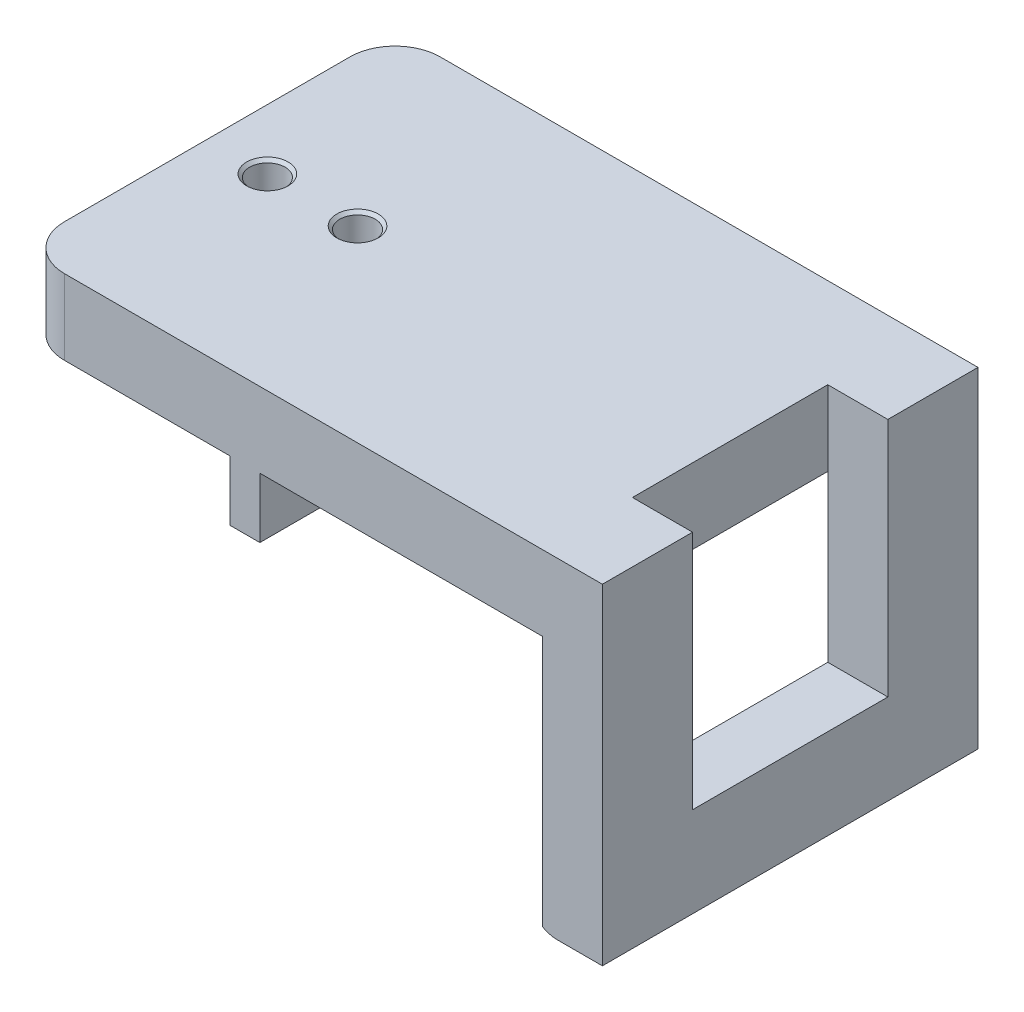
ISO-10303-21;
HEADER;
FILE_DESCRIPTION(('STEP AP214'),'2;1');
FILE_NAME('part.step','',(''),(''),'','','');
FILE_SCHEMA(('AUTOMOTIVE_DESIGN { 1 0 10303 214 1 1 1 1 }'));
ENDSEC;
DATA;
#1=APPLICATION_CONTEXT('core data for automotive mechanical design processes');
#2=APPLICATION_PROTOCOL_DEFINITION('international standard','automotive_design',2000,#1);
#3=PRODUCT_CONTEXT('',#1,'mechanical');
#4=PRODUCT('Part','Part','',(#3));
#5=PRODUCT_RELATED_PRODUCT_CATEGORY('part','',(#4));
#6=PRODUCT_DEFINITION_FORMATION('','',#4);
#7=PRODUCT_DEFINITION_CONTEXT('part definition',#1,'design');
#8=PRODUCT_DEFINITION('design','',#6,#7);
#9=PRODUCT_DEFINITION_SHAPE('','',#8);
#10=(LENGTH_UNIT() NAMED_UNIT(*) SI_UNIT(.MILLI.,.METRE.));
#11=(NAMED_UNIT(*) PLANE_ANGLE_UNIT() SI_UNIT($,.RADIAN.));
#12=(NAMED_UNIT(*) SI_UNIT($,.STERADIAN.) SOLID_ANGLE_UNIT());
#13=UNCERTAINTY_MEASURE_WITH_UNIT(LENGTH_MEASURE(1.E-05),#10,'distance_accuracy_value','');
#14=(GEOMETRIC_REPRESENTATION_CONTEXT(3) GLOBAL_UNCERTAINTY_ASSIGNED_CONTEXT((#13)) GLOBAL_UNIT_ASSIGNED_CONTEXT((#10,
#11,#12)) REPRESENTATION_CONTEXT('',''));
#15=CARTESIAN_POINT('',(0.,0.,0.));
#16=DIRECTION('',(0.,0.,1.));
#17=DIRECTION('',(1.,0.,0.));
#18=AXIS2_PLACEMENT_3D('',#15,#16,#17);
#19=CARTESIAN_POINT('',(44.196,0.,0.));
#20=DIRECTION('',(-1.,0.,0.));
#21=DIRECTION('',(0.,0.,1.));
#22=AXIS2_PLACEMENT_3D('',#19,#20,#21);
#23=PLANE('',#22);
#24=DIRECTION('',(0.,1.,0.));
#25=VECTOR('',#24,1.);
#26=CARTESIAN_POINT('',(44.196,-21.59,-7.62));
#27=LINE('',#26,#25);
#28=CARTESIAN_POINT('',(44.196,-21.2497045256125,-7.62));
#29=VERTEX_POINT('',#28);
#30=CARTESIAN_POINT('',(44.196,-19.05,-7.62));
#31=VERTEX_POINT('',#30);
#32=EDGE_CURVE('E193',#29,#31,#27,.T.);
#33=ORIENTED_EDGE('',*,*,#32,.F.);
#34=DIRECTION('',(0.,0.,1.));
#35=VECTOR('',#34,1.);
#36=CARTESIAN_POINT('',(44.196,-21.2497045256125,-7.62));
#37=LINE('',#36,#35);
#38=CARTESIAN_POINT('',(44.196,-21.2497045256125,0.));
#39=VERTEX_POINT('',#38);
#40=EDGE_CURVE('E184',#29,#39,#37,.T.);
#41=ORIENTED_EDGE('',*,*,#40,.T.);
#42=DIRECTION('',(0.,-1.,0.));
#43=VECTOR('',#42,1.);
#44=CARTESIAN_POINT('',(44.196,6.35,0.));
#45=LINE('',#44,#43);
#46=CARTESIAN_POINT('',(44.196,0.,0.));
#47=VERTEX_POINT('',#46);
#48=EDGE_CURVE('E196',#47,#39,#45,.T.);
#49=ORIENTED_EDGE('',*,*,#48,.F.);
#50=DIRECTION('',(0.,0.,-1.));
#51=VECTOR('',#50,1.);
#52=CARTESIAN_POINT('',(44.196,0.,0.));
#53=LINE('',#52,#51);
#54=CARTESIAN_POINT('',(44.196,0.,-7.62));
#55=VERTEX_POINT('',#54);
#56=EDGE_CURVE('E406',#47,#55,#53,.T.);
#57=ORIENTED_EDGE('',*,*,#56,.T.);
#58=DIRECTION('',(0.,1.,0.));
#59=VECTOR('',#58,1.);
#60=CARTESIAN_POINT('',(44.196,6.35,-7.62));
#61=LINE('',#60,#59);
#62=CARTESIAN_POINT('',(44.196,-13.97,-7.62));
#63=VERTEX_POINT('',#62);
#64=EDGE_CURVE('E215',#63,#55,#61,.T.);
#65=ORIENTED_EDGE('',*,*,#64,.F.);
#66=DIRECTION('',(0.,0.,1.));
#67=VECTOR('',#66,1.);
#68=CARTESIAN_POINT('',(44.196,-13.97,-7.62));
#69=LINE('',#68,#67);
#70=CARTESIAN_POINT('',(44.196,-13.97,-24.13));
#71=VERTEX_POINT('',#70);
#72=EDGE_CURVE('E452',#71,#63,#69,.T.);
#73=ORIENTED_EDGE('',*,*,#72,.F.);
#74=DIRECTION('',(0.,-1.,0.));
#75=VECTOR('',#74,1.);
#76=CARTESIAN_POINT('',(44.196,-13.97,-24.13));
#77=LINE('',#76,#75);
#78=CARTESIAN_POINT('',(44.196,0.,-24.13));
#79=VERTEX_POINT('',#78);
#80=EDGE_CURVE('E420',#79,#71,#77,.T.);
#81=ORIENTED_EDGE('',*,*,#80,.F.);
#82=CARTESIAN_POINT('',(44.196,0.,-31.75));
#83=VERTEX_POINT('',#82);
#84=EDGE_CURVE('E297',#79,#83,#53,.T.);
#85=ORIENTED_EDGE('',*,*,#84,.T.);
#86=DIRECTION('',(0.,1.,0.));
#87=VECTOR('',#86,1.);
#88=CARTESIAN_POINT('',(44.196,6.35,-31.75));
#89=LINE('',#88,#87);
#90=CARTESIAN_POINT('',(44.196,-21.2497045256125,-31.75));
#91=VERTEX_POINT('',#90);
#92=EDGE_CURVE('E238',#91,#83,#89,.T.);
#93=ORIENTED_EDGE('',*,*,#92,.F.);
#94=DIRECTION('',(0.,0.,1.));
#95=VECTOR('',#94,1.);
#96=CARTESIAN_POINT('',(44.196,-21.2497045256125,-31.75));
#97=LINE('',#96,#95);
#98=CARTESIAN_POINT('',(44.196,-21.2497045256125,-24.13));
#99=VERTEX_POINT('',#98);
#100=EDGE_CURVE('E187',#91,#99,#97,.T.);
#101=ORIENTED_EDGE('',*,*,#100,.T.);
#102=DIRECTION('',(0.,-1.,0.));
#103=VECTOR('',#102,1.);
#104=CARTESIAN_POINT('',(44.196,-21.59,-24.13));
#105=LINE('',#104,#103);
#106=CARTESIAN_POINT('',(44.196,-19.05,-24.13));
#107=VERTEX_POINT('',#106);
#108=EDGE_CURVE('E207',#107,#99,#105,.T.);
#109=ORIENTED_EDGE('',*,*,#108,.F.);
#110=DIRECTION('',(0.,0.,-1.));
#111=VECTOR('',#110,1.);
#112=CARTESIAN_POINT('',(44.196,-19.05,-24.13));
#113=LINE('',#112,#111);
#114=EDGE_CURVE('E202',#31,#107,#113,.T.);
#115=ORIENTED_EDGE('',*,*,#114,.F.);
#116=EDGE_LOOP('',(#33,#41,#49,#57,#65,#73,#81,#85,#93,#101,#109,#115));
#117=FACE_BOUND('',#116,.T.);
#118=ADVANCED_FACE('F33',(#117),#23,.T.);
#119=CARTESIAN_POINT('',(44.196,6.35,0.));
#120=DIRECTION('',(-1.,0.,0.));
#121=DIRECTION('',(0.,0.,1.));
#122=AXIS2_PLACEMENT_3D('',#119,#120,#121);
#123=PLANE('',#122);
#124=CARTESIAN_POINT('',(44.196,6.35,-7.62));
#125=VERTEX_POINT('',#124);
#126=EDGE_CURVE('E188',#55,#125,#61,.T.);
#127=ORIENTED_EDGE('',*,*,#126,.F.);
#128=EDGE_CURVE('E305',#55,#79,#53,.T.);
#129=ORIENTED_EDGE('',*,*,#128,.T.);
#130=CARTESIAN_POINT('',(44.196,6.35,-24.13));
#131=VERTEX_POINT('',#130);
#132=EDGE_CURVE('E434',#131,#79,#77,.T.);
#133=ORIENTED_EDGE('',*,*,#132,.F.);
#134=DIRECTION('',(0.,0.,-1.));
#135=VECTOR('',#134,1.);
#136=CARTESIAN_POINT('',(44.196,6.35,0.));
#137=LINE('',#136,#135);
#138=EDGE_CURVE('E355',#125,#131,#137,.T.);
#139=ORIENTED_EDGE('',*,*,#138,.F.);
#140=EDGE_LOOP('',(#127,#129,#133,#139));
#141=FACE_BOUND('',#140,.T.);
#142=ADVANCED_FACE('F432',(#141),#123,.F.);
#143=CARTESIAN_POINT('',(0.,0.,0.));
#144=DIRECTION('',(0.,-1.,0.));
#145=DIRECTION('',(0.,0.,-1.));
#146=AXIS2_PLACEMENT_3D('',#143,#144,#145);
#147=PLANE('',#146);
#148=DIRECTION('',(0.,0.,1.));
#149=VECTOR('',#148,1.);
#150=CARTESIAN_POINT('',(20.32,0.,0.));
#151=LINE('',#150,#149);
#152=CARTESIAN_POINT('',(20.32,0.,-31.75));
#153=VERTEX_POINT('',#152);
#154=CARTESIAN_POINT('',(20.32,0.,0.));
#155=VERTEX_POINT('',#154);
#156=EDGE_CURVE('E257',#153,#155,#151,.T.);
#157=ORIENTED_EDGE('',*,*,#156,.F.);
#158=DIRECTION('',(-1.,0.,0.));
#159=VECTOR('',#158,1.);
#160=CARTESIAN_POINT('',(0.,0.,-31.75));
#161=LINE('',#160,#159);
#162=EDGE_CURVE('E400',#83,#153,#161,.T.);
#163=ORIENTED_EDGE('',*,*,#162,.F.);
#164=ORIENTED_EDGE('',*,*,#84,.F.);
#165=ORIENTED_EDGE('',*,*,#128,.F.);
#166=ORIENTED_EDGE('',*,*,#56,.F.);
#167=DIRECTION('',(1.,0.,0.));
#168=VECTOR('',#167,1.);
#169=CARTESIAN_POINT('',(0.,0.,0.));
#170=LINE('',#169,#168);
#171=EDGE_CURVE('E298',#155,#47,#170,.T.);
#172=ORIENTED_EDGE('',*,*,#171,.F.);
#173=EDGE_LOOP('',(#157,#163,#164,#165,#166,#172));
#174=FACE_BOUND('',#173,.T.);
#175=ADVANCED_FACE('F398',(#174),#147,.T.);
#176=CARTESIAN_POINT('',(0.,6.35,0.));
#177=DIRECTION('',(1.,0.,0.));
#178=DIRECTION('',(0.,0.,-1.));
#179=AXIS2_PLACEMENT_3D('',#176,#177,#178);
#180=PLANE('',#179);
#181=DIRECTION('',(0.,0.,1.));
#182=VECTOR('',#181,1.);
#183=CARTESIAN_POINT('',(0.,0.,0.));
#184=LINE('',#183,#182);
#185=CARTESIAN_POINT('',(0.,0.,-27.94));
#186=VERTEX_POINT('',#185);
#187=CARTESIAN_POINT('',(0.,0.,-3.81));
#188=VERTEX_POINT('',#187);
#189=EDGE_CURVE('E303',#186,#188,#184,.T.);
#190=ORIENTED_EDGE('',*,*,#189,.T.);
#191=DIRECTION('',(0.,-1.,0.));
#192=VECTOR('',#191,1.);
#193=CARTESIAN_POINT('',(0.,6.35,-3.81));
#194=LINE('',#193,#192);
#195=CARTESIAN_POINT('',(0.,6.35,-3.81));
#196=VERTEX_POINT('',#195);
#197=EDGE_CURVE('E334',#188,#196,#194,.F.);
#198=ORIENTED_EDGE('',*,*,#197,.T.);
#199=DIRECTION('',(0.,0.,1.));
#200=VECTOR('',#199,1.);
#201=CARTESIAN_POINT('',(0.,6.35,0.));
#202=LINE('',#201,#200);
#203=CARTESIAN_POINT('',(0.,6.35,-27.94));
#204=VERTEX_POINT('',#203);
#205=EDGE_CURVE('E405',#204,#196,#202,.T.);
#206=ORIENTED_EDGE('',*,*,#205,.F.);
#207=DIRECTION('',(0.,-1.,0.));
#208=VECTOR('',#207,1.);
#209=CARTESIAN_POINT('',(0.,6.35,-27.94));
#210=LINE('',#209,#208);
#211=EDGE_CURVE('E337',#204,#186,#210,.T.);
#212=ORIENTED_EDGE('',*,*,#211,.T.);
#213=EDGE_LOOP('',(#190,#198,#206,#212));
#214=FACE_BOUND('',#213,.T.);
#215=ADVANCED_FACE('F332',(#214),#180,.F.);
#216=CARTESIAN_POINT('',(0.,6.35,0.));
#217=DIRECTION('',(0.,0.,-1.));
#218=DIRECTION('',(-1.,0.,0.));
#219=AXIS2_PLACEMENT_3D('',#216,#217,#218);
#220=PLANE('',#219);
#221=ORIENTED_EDGE('',*,*,#48,.T.);
#222=CARTESIAN_POINT('',(45.466,-19.05,0.));
#223=DIRECTION('',(0.,0.,-1.));
#224=DIRECTION('',(-1.,0.,0.));
#225=AXIS2_PLACEMENT_3D('',#222,#223,#224);
#226=CIRCLE('',#225,2.54);
#227=CARTESIAN_POINT('',(45.466,-21.59,0.));
#228=VERTEX_POINT('',#227);
#229=EDGE_CURVE('E56',#39,#228,#226,.F.);
#230=ORIENTED_EDGE('',*,*,#229,.T.);
#231=DIRECTION('',(-1.,0.,0.));
#232=VECTOR('',#231,1.);
#233=CARTESIAN_POINT('',(49.276,-21.59,0.));
#234=LINE('',#233,#232);
#235=CARTESIAN_POINT('',(49.276,-21.59,0.));
#236=VERTEX_POINT('',#235);
#237=EDGE_CURVE('E239',#236,#228,#234,.T.);
#238=ORIENTED_EDGE('',*,*,#237,.F.);
#239=DIRECTION('',(0.,-1.,0.));
#240=VECTOR('',#239,1.);
#241=CARTESIAN_POINT('',(49.276,6.35,0.));
#242=LINE('',#241,#240);
#243=CARTESIAN_POINT('',(49.276,6.35,0.));
#244=VERTEX_POINT('',#243);
#245=EDGE_CURVE('E214',#244,#236,#242,.T.);
#246=ORIENTED_EDGE('',*,*,#245,.F.);
#247=DIRECTION('',(1.,0.,0.));
#248=VECTOR('',#247,1.);
#249=CARTESIAN_POINT('',(0.,6.35,0.));
#250=LINE('',#249,#248);
#251=CARTESIAN_POINT('',(3.81,6.35,0.));
#252=VERTEX_POINT('',#251);
#253=EDGE_CURVE('E359',#252,#244,#250,.T.);
#254=ORIENTED_EDGE('',*,*,#253,.F.);
#255=DIRECTION('',(0.,-1.,0.));
#256=VECTOR('',#255,1.);
#257=CARTESIAN_POINT('',(3.81,6.35,0.));
#258=LINE('',#257,#256);
#259=CARTESIAN_POINT('',(3.81,0.,0.));
#260=VERTEX_POINT('',#259);
#261=EDGE_CURVE('E293',#252,#260,#258,.T.);
#262=ORIENTED_EDGE('',*,*,#261,.T.);
#263=CARTESIAN_POINT('',(17.78,0.,0.));
#264=VERTEX_POINT('',#263);
#265=EDGE_CURVE('E294',#260,#264,#170,.T.);
#266=ORIENTED_EDGE('',*,*,#265,.T.);
#267=DIRECTION('',(0.,1.,0.));
#268=VECTOR('',#267,1.);
#269=CARTESIAN_POINT('',(17.78,-5.08,0.));
#270=LINE('',#269,#268);
#271=CARTESIAN_POINT('',(17.78,-5.08,0.));
#272=VERTEX_POINT('',#271);
#273=EDGE_CURVE('E318',#272,#264,#270,.T.);
#274=ORIENTED_EDGE('',*,*,#273,.F.);
#275=DIRECTION('',(-1.,0.,0.));
#276=VECTOR('',#275,1.);
#277=CARTESIAN_POINT('',(20.32,-5.08,0.));
#278=LINE('',#277,#276);
#279=CARTESIAN_POINT('',(20.32,-5.08,0.));
#280=VERTEX_POINT('',#279);
#281=EDGE_CURVE('E244',#280,#272,#278,.T.);
#282=ORIENTED_EDGE('',*,*,#281,.F.);
#283=DIRECTION('',(0.,1.,0.));
#284=VECTOR('',#283,1.);
#285=CARTESIAN_POINT('',(20.32,-5.08,0.));
#286=LINE('',#285,#284);
#287=EDGE_CURVE('E323',#280,#155,#286,.T.);
#288=ORIENTED_EDGE('',*,*,#287,.T.);
#289=ORIENTED_EDGE('',*,*,#171,.T.);
#290=EDGE_LOOP('',(#221,#230,#238,#246,#254,#262,#266,#274,#282,#288,#289));
#291=FACE_BOUND('',#290,.T.);
#292=ADVANCED_FACE('F379',(#291),#220,.F.);
#293=CARTESIAN_POINT('',(0.,6.35,-31.75));
#294=DIRECTION('',(0.,0.,1.));
#295=DIRECTION('',(1.,0.,0.));
#296=AXIS2_PLACEMENT_3D('',#293,#294,#295);
#297=PLANE('',#296);
#298=DIRECTION('',(-1.,0.,0.));
#299=VECTOR('',#298,1.);
#300=CARTESIAN_POINT('',(49.276,-21.59,-31.75));
#301=LINE('',#300,#299);
#302=CARTESIAN_POINT('',(49.276,-21.59,-31.75));
#303=VERTEX_POINT('',#302);
#304=CARTESIAN_POINT('',(45.466,-21.59,-31.75));
#305=VERTEX_POINT('',#304);
#306=EDGE_CURVE('E424',#303,#305,#301,.T.);
#307=ORIENTED_EDGE('',*,*,#306,.T.);
#308=CARTESIAN_POINT('',(45.466,-19.05,-31.75));
#309=DIRECTION('',(0.,0.,1.));
#310=DIRECTION('',(1.,0.,0.));
#311=AXIS2_PLACEMENT_3D('',#308,#309,#310);
#312=CIRCLE('',#311,2.54);
#313=EDGE_CURVE('E41',#305,#91,#312,.F.);
#314=ORIENTED_EDGE('',*,*,#313,.T.);
#315=ORIENTED_EDGE('',*,*,#92,.T.);
#316=ORIENTED_EDGE('',*,*,#162,.T.);
#317=DIRECTION('',(0.,1.,0.));
#318=VECTOR('',#317,1.);
#319=CARTESIAN_POINT('',(20.32,-5.08,-31.75));
#320=LINE('',#319,#318);
#321=CARTESIAN_POINT('',(20.32,-5.08,-31.75));
#322=VERTEX_POINT('',#321);
#323=EDGE_CURVE('E251',#322,#153,#320,.T.);
#324=ORIENTED_EDGE('',*,*,#323,.F.);
#325=DIRECTION('',(1.,0.,0.));
#326=VECTOR('',#325,1.);
#327=CARTESIAN_POINT('',(20.32,-5.08,-31.75));
#328=LINE('',#327,#326);
#329=CARTESIAN_POINT('',(17.78,-5.08,-31.75));
#330=VERTEX_POINT('',#329);
#331=EDGE_CURVE('E249',#330,#322,#328,.T.);
#332=ORIENTED_EDGE('',*,*,#331,.F.);
#333=DIRECTION('',(0.,1.,0.));
#334=VECTOR('',#333,1.);
#335=CARTESIAN_POINT('',(17.78,-5.08,-31.75));
#336=LINE('',#335,#334);
#337=CARTESIAN_POINT('',(17.78,0.,-31.75));
#338=VERTEX_POINT('',#337);
#339=EDGE_CURVE('E265',#330,#338,#336,.T.);
#340=ORIENTED_EDGE('',*,*,#339,.T.);
#341=CARTESIAN_POINT('',(3.81,0.,-31.75));
#342=VERTEX_POINT('',#341);
#343=EDGE_CURVE('E312',#338,#342,#161,.T.);
#344=ORIENTED_EDGE('',*,*,#343,.T.);
#345=DIRECTION('',(0.,-1.,0.));
#346=VECTOR('',#345,1.);
#347=CARTESIAN_POINT('',(3.81,6.35,-31.75));
#348=LINE('',#347,#346);
#349=CARTESIAN_POINT('',(3.81,6.35,-31.75));
#350=VERTEX_POINT('',#349);
#351=EDGE_CURVE('E353',#342,#350,#348,.F.);
#352=ORIENTED_EDGE('',*,*,#351,.T.);
#353=DIRECTION('',(-1.,0.,0.));
#354=VECTOR('',#353,1.);
#355=CARTESIAN_POINT('',(0.,6.35,-31.75));
#356=LINE('',#355,#354);
#357=CARTESIAN_POINT('',(49.276,6.35,-31.75));
#358=VERTEX_POINT('',#357);
#359=EDGE_CURVE('E272',#358,#350,#356,.T.);
#360=ORIENTED_EDGE('',*,*,#359,.F.);
#361=DIRECTION('',(0.,1.,0.));
#362=VECTOR('',#361,1.);
#363=CARTESIAN_POINT('',(49.276,6.35,-31.75));
#364=LINE('',#363,#362);
#365=EDGE_CURVE('E219',#303,#358,#364,.T.);
#366=ORIENTED_EDGE('',*,*,#365,.F.);
#367=EDGE_LOOP('',(#307,#314,#315,#316,#324,#332,#340,#344,#352,#360,#366));
#368=FACE_BOUND('',#367,.T.);
#369=ADVANCED_FACE('F403',(#368),#297,.F.);
#370=CARTESIAN_POINT('',(0.,6.35,0.));
#371=DIRECTION('',(0.,-1.,0.));
#372=DIRECTION('',(0.,0.,-1.));
#373=AXIS2_PLACEMENT_3D('',#370,#371,#372);
#374=PLANE('',#373);
#375=CARTESIAN_POINT('',(12.7,6.35,-15.875));
#376=DIRECTION('',(0.,-1.,0.));
#377=DIRECTION('',(0.,0.,-1.));
#378=AXIS2_PLACEMENT_3D('',#375,#376,#377);
#379=CIRCLE('',#378,1.75399999999999);
#380=CARTESIAN_POINT('',(12.7,6.35,-17.629));
#381=VERTEX_POINT('',#380);
#382=EDGE_CURVE('E290',#381,#381,#379,.T.);
#383=ORIENTED_EDGE('',*,*,#382,.T.);
#384=EDGE_LOOP('',(#383));
#385=FACE_BOUND('',#384,.T.);
#386=CARTESIAN_POINT('',(5.08,6.35,-15.875));
#387=DIRECTION('',(0.,-1.,0.));
#388=DIRECTION('',(0.,0.,-1.));
#389=AXIS2_PLACEMENT_3D('',#386,#387,#388);
#390=CIRCLE('',#389,1.75399999999999);
#391=CARTESIAN_POINT('',(5.08,6.35,-17.629));
#392=VERTEX_POINT('',#391);
#393=EDGE_CURVE('E287',#392,#392,#390,.T.);
#394=ORIENTED_EDGE('',*,*,#393,.T.);
#395=EDGE_LOOP('',(#394));
#396=FACE_BOUND('',#395,.T.);
#397=ORIENTED_EDGE('',*,*,#205,.T.);
#398=CARTESIAN_POINT('',(3.81,6.35,-3.81));
#399=DIRECTION('',(0.,-1.,0.));
#400=DIRECTION('',(0.,0.,-1.));
#401=AXIS2_PLACEMENT_3D('',#398,#399,#400);
#402=CIRCLE('',#401,3.81);
#403=EDGE_CURVE('E345',#196,#252,#402,.F.);
#404=ORIENTED_EDGE('',*,*,#403,.T.);
#405=ORIENTED_EDGE('',*,*,#253,.T.);
#406=DIRECTION('',(0.,0.,1.));
#407=VECTOR('',#406,1.);
#408=CARTESIAN_POINT('',(49.276,6.35,0.));
#409=LINE('',#408,#407);
#410=CARTESIAN_POINT('',(49.276,6.35,-7.62));
#411=VERTEX_POINT('',#410);
#412=EDGE_CURVE('E211',#411,#244,#409,.T.);
#413=ORIENTED_EDGE('',*,*,#412,.F.);
#414=DIRECTION('',(-1.,0.,0.));
#415=VECTOR('',#414,1.);
#416=CARTESIAN_POINT('',(49.276,6.35,-7.62));
#417=LINE('',#416,#415);
#418=EDGE_CURVE('E230',#411,#125,#417,.T.);
#419=ORIENTED_EDGE('',*,*,#418,.T.);
#420=ORIENTED_EDGE('',*,*,#138,.T.);
#421=DIRECTION('',(-1.,0.,0.));
#422=VECTOR('',#421,1.);
#423=CARTESIAN_POINT('',(49.276,6.35,-24.13));
#424=LINE('',#423,#422);
#425=CARTESIAN_POINT('',(49.276,6.35,-24.13));
#426=VERTEX_POINT('',#425);
#427=EDGE_CURVE('E451',#426,#131,#424,.T.);
#428=ORIENTED_EDGE('',*,*,#427,.F.);
#429=DIRECTION('',(0.,0.,1.));
#430=VECTOR('',#429,1.);
#431=CARTESIAN_POINT('',(49.276,6.35,-24.13));
#432=LINE('',#431,#430);
#433=EDGE_CURVE('E222',#358,#426,#432,.T.);
#434=ORIENTED_EDGE('',*,*,#433,.F.);
#435=ORIENTED_EDGE('',*,*,#359,.T.);
#436=CARTESIAN_POINT('',(3.81,6.35,-27.94));
#437=DIRECTION('',(0.,-1.,0.));
#438=DIRECTION('',(0.,0.,-1.));
#439=AXIS2_PLACEMENT_3D('',#436,#437,#438);
#440=CIRCLE('',#439,3.81);
#441=EDGE_CURVE('E346',#350,#204,#440,.F.);
#442=ORIENTED_EDGE('',*,*,#441,.T.);
#443=EDGE_LOOP('',(#397,#404,#405,#413,#419,#420,#428,#434,#435,#442));
#444=FACE_BOUND('',#443,.T.);
#445=ADVANCED_FACE('F368',(#385,#396,#444),#374,.F.);
#446=CARTESIAN_POINT('',(5.08,0.,-15.875));
#447=DIRECTION('',(0.,-1.,0.));
#448=DIRECTION('',(0.,0.,-1.));
#449=AXIS2_PLACEMENT_3D('',#446,#447,#448);
#450=CIRCLE('',#449,1.754);
#451=CARTESIAN_POINT('',(5.08,0.,-17.629));
#452=VERTEX_POINT('',#451);
#453=EDGE_CURVE('E278',#452,#452,#450,.F.);
#454=ORIENTED_EDGE('',*,*,#453,.T.);
#455=EDGE_LOOP('',(#454));
#456=FACE_BOUND('',#455,.T.);
#457=CARTESIAN_POINT('',(12.7,0.,-15.875));
#458=DIRECTION('',(0.,-1.,0.));
#459=DIRECTION('',(0.,0.,-1.));
#460=AXIS2_PLACEMENT_3D('',#457,#458,#459);
#461=CIRCLE('',#460,1.754);
#462=CARTESIAN_POINT('',(12.7,0.,-17.629));
#463=VERTEX_POINT('',#462);
#464=EDGE_CURVE('E275',#463,#463,#461,.F.);
#465=ORIENTED_EDGE('',*,*,#464,.T.);
#466=EDGE_LOOP('',(#465));
#467=FACE_BOUND('',#466,.T.);
#468=ORIENTED_EDGE('',*,*,#265,.F.);
#469=CARTESIAN_POINT('',(3.81,0.,-3.81));
#470=DIRECTION('',(0.,-1.,0.));
#471=DIRECTION('',(0.,0.,-1.));
#472=AXIS2_PLACEMENT_3D('',#469,#470,#471);
#473=CIRCLE('',#472,3.81);
#474=EDGE_CURVE('E343',#260,#188,#473,.T.);
#475=ORIENTED_EDGE('',*,*,#474,.T.);
#476=ORIENTED_EDGE('',*,*,#189,.F.);
#477=CARTESIAN_POINT('',(3.81,0.,-27.94));
#478=DIRECTION('',(0.,-1.,0.));
#479=DIRECTION('',(0.,0.,-1.));
#480=AXIS2_PLACEMENT_3D('',#477,#478,#479);
#481=CIRCLE('',#480,3.81);
#482=EDGE_CURVE('E375',#186,#342,#481,.T.);
#483=ORIENTED_EDGE('',*,*,#482,.T.);
#484=ORIENTED_EDGE('',*,*,#343,.F.);
#485=DIRECTION('',(0.,0.,-1.));
#486=VECTOR('',#485,1.);
#487=CARTESIAN_POINT('',(17.78,0.,0.));
#488=LINE('',#487,#486);
#489=EDGE_CURVE('E245',#264,#338,#488,.T.);
#490=ORIENTED_EDGE('',*,*,#489,.F.);
#491=EDGE_LOOP('',(#468,#475,#476,#483,#484,#490));
#492=FACE_BOUND('',#491,.T.);
#493=ADVANCED_FACE('F383',(#456,#467,#492),#147,.T.);
#494=CARTESIAN_POINT('',(20.32,-5.08,0.));
#495=DIRECTION('',(-1.,0.,0.));
#496=DIRECTION('',(0.,0.,1.));
#497=AXIS2_PLACEMENT_3D('',#494,#495,#496);
#498=PLANE('',#497);
#499=ORIENTED_EDGE('',*,*,#156,.T.);
#500=ORIENTED_EDGE('',*,*,#287,.F.);
#501=DIRECTION('',(0.,0.,1.));
#502=VECTOR('',#501,1.);
#503=CARTESIAN_POINT('',(20.32,-5.08,0.));
#504=LINE('',#503,#502);
#505=EDGE_CURVE('E241',#322,#280,#504,.T.);
#506=ORIENTED_EDGE('',*,*,#505,.F.);
#507=ORIENTED_EDGE('',*,*,#323,.T.);
#508=EDGE_LOOP('',(#499,#500,#506,#507));
#509=FACE_BOUND('',#508,.T.);
#510=ADVANCED_FACE('F394',(#509),#498,.F.);
#511=CARTESIAN_POINT('',(17.78,-5.08,0.));
#512=DIRECTION('',(1.,0.,0.));
#513=DIRECTION('',(0.,0.,-1.));
#514=AXIS2_PLACEMENT_3D('',#511,#512,#513);
#515=PLANE('',#514);
#516=ORIENTED_EDGE('',*,*,#489,.T.);
#517=ORIENTED_EDGE('',*,*,#339,.F.);
#518=DIRECTION('',(0.,0.,-1.));
#519=VECTOR('',#518,1.);
#520=CARTESIAN_POINT('',(17.78,-5.08,0.));
#521=LINE('',#520,#519);
#522=EDGE_CURVE('E247',#272,#330,#521,.T.);
#523=ORIENTED_EDGE('',*,*,#522,.F.);
#524=ORIENTED_EDGE('',*,*,#273,.T.);
#525=EDGE_LOOP('',(#516,#517,#523,#524));
#526=FACE_BOUND('',#525,.T.);
#527=ADVANCED_FACE('F387',(#526),#515,.F.);
#528=CARTESIAN_POINT('',(0.,-5.08,0.));
#529=DIRECTION('',(0.,1.,0.));
#530=DIRECTION('',(0.,0.,1.));
#531=AXIS2_PLACEMENT_3D('',#528,#529,#530);
#532=PLANE('',#531);
#533=ORIENTED_EDGE('',*,*,#505,.T.);
#534=ORIENTED_EDGE('',*,*,#281,.T.);
#535=ORIENTED_EDGE('',*,*,#522,.T.);
#536=ORIENTED_EDGE('',*,*,#331,.T.);
#537=EDGE_LOOP('',(#533,#534,#535,#536));
#538=FACE_BOUND('',#537,.T.);
#539=ADVANCED_FACE('F390',(#538),#532,.F.);
#540=CARTESIAN_POINT('',(12.7,6.35,-15.875));
#541=DIRECTION('',(0.,1.,0.));
#542=DIRECTION('',(0.,0.,1.));
#543=AXIS2_PLACEMENT_3D('',#540,#541,#542);
#544=CYLINDRICAL_SURFACE('',#543,1.49999999999999);
#545=CARTESIAN_POINT('',(12.7,0.254000000000011,-15.875));
#546=DIRECTION('',(0.,-1.,0.));
#547=DIRECTION('',(0.,0.,-1.));
#548=AXIS2_PLACEMENT_3D('',#545,#546,#547);
#549=CIRCLE('',#548,1.49999999999999);
#550=CARTESIAN_POINT('',(12.7,0.254000000000011,-17.375));
#551=VERTEX_POINT('',#550);
#552=EDGE_CURVE('E284',#551,#551,#549,.T.);
#553=ORIENTED_EDGE('',*,*,#552,.T.);
#554=EDGE_LOOP('',(#553));
#555=FACE_BOUND('',#554,.T.);
#556=CARTESIAN_POINT('',(12.7,6.096,-15.875));
#557=DIRECTION('',(0.,-1.,0.));
#558=DIRECTION('',(0.,0.,-1.));
#559=AXIS2_PLACEMENT_3D('',#556,#557,#558);
#560=CIRCLE('',#559,1.49999999999999);
#561=CARTESIAN_POINT('',(12.7,6.096,-17.375));
#562=VERTEX_POINT('',#561);
#563=EDGE_CURVE('E281',#562,#562,#560,.F.);
#564=ORIENTED_EDGE('',*,*,#563,.T.);
#565=EDGE_LOOP('',(#564));
#566=FACE_BOUND('',#565,.T.);
#567=ADVANCED_FACE('F675',(#555,#566),#544,.F.);
#568=CARTESIAN_POINT('',(5.08,6.35,-15.875));
#569=DIRECTION('',(0.,1.,0.));
#570=DIRECTION('',(0.,0.,1.));
#571=AXIS2_PLACEMENT_3D('',#568,#569,#570);
#572=CYLINDRICAL_SURFACE('',#571,1.49999999999999);
#573=CARTESIAN_POINT('',(5.08,0.254000000000011,-15.875));
#574=DIRECTION('',(0.,-1.,0.));
#575=DIRECTION('',(0.,0.,-1.));
#576=AXIS2_PLACEMENT_3D('',#573,#574,#575);
#577=CIRCLE('',#576,1.49999999999999);
#578=CARTESIAN_POINT('',(5.08,0.254000000000011,-17.375));
#579=VERTEX_POINT('',#578);
#580=EDGE_CURVE('E271',#579,#579,#577,.T.);
#581=ORIENTED_EDGE('',*,*,#580,.T.);
#582=EDGE_LOOP('',(#581));
#583=FACE_BOUND('',#582,.T.);
#584=CARTESIAN_POINT('',(5.08,6.096,-15.875));
#585=DIRECTION('',(0.,-1.,0.));
#586=DIRECTION('',(0.,0.,-1.));
#587=AXIS2_PLACEMENT_3D('',#584,#585,#586);
#588=CIRCLE('',#587,1.49999999999999);
#589=CARTESIAN_POINT('',(5.08,6.096,-17.375));
#590=VERTEX_POINT('',#589);
#591=EDGE_CURVE('E268',#590,#590,#588,.F.);
#592=ORIENTED_EDGE('',*,*,#591,.T.);
#593=EDGE_LOOP('',(#592));
#594=FACE_BOUND('',#593,.T.);
#595=ADVANCED_FACE('F665',(#583,#594),#572,.F.);
#596=CARTESIAN_POINT('',(5.08,0.254000000000011,-15.875));
#597=DIRECTION('',(0.,-1.,0.));
#598=DIRECTION('',(0.,0.,-1.));
#599=AXIS2_PLACEMENT_3D('',#596,#597,#598);
#600=CONICAL_SURFACE('',#599,1.49999999999999,0.785398163397438);
#601=ORIENTED_EDGE('',*,*,#453,.F.);
#602=EDGE_LOOP('',(#601));
#603=FACE_BOUND('',#602,.T.);
#604=ORIENTED_EDGE('',*,*,#580,.F.);
#605=EDGE_LOOP('',(#604));
#606=FACE_BOUND('',#605,.T.);
#607=ADVANCED_FACE('F655',(#603,#606),#600,.F.);
#608=CARTESIAN_POINT('',(12.7,0.254000000000011,-15.875));
#609=DIRECTION('',(0.,-1.,0.));
#610=DIRECTION('',(0.,0.,-1.));
#611=AXIS2_PLACEMENT_3D('',#608,#609,#610);
#612=CONICAL_SURFACE('',#611,1.49999999999999,0.785398163397438);
#613=ORIENTED_EDGE('',*,*,#464,.F.);
#614=EDGE_LOOP('',(#613));
#615=FACE_BOUND('',#614,.T.);
#616=ORIENTED_EDGE('',*,*,#552,.F.);
#617=EDGE_LOOP('',(#616));
#618=FACE_BOUND('',#617,.T.);
#619=ADVANCED_FACE('F645',(#615,#618),#612,.F.);
#620=CARTESIAN_POINT('',(12.7,6.096,-15.875));
#621=DIRECTION('',(0.,1.,0.));
#622=DIRECTION('',(0.,0.,1.));
#623=AXIS2_PLACEMENT_3D('',#620,#621,#622);
#624=CONICAL_SURFACE('',#623,1.49999999999999,0.785398163397438);
#625=ORIENTED_EDGE('',*,*,#382,.F.);
#626=EDGE_LOOP('',(#625));
#627=FACE_BOUND('',#626,.T.);
#628=ORIENTED_EDGE('',*,*,#563,.F.);
#629=EDGE_LOOP('',(#628));
#630=FACE_BOUND('',#629,.T.);
#631=ADVANCED_FACE('F635',(#627,#630),#624,.F.);
#632=CARTESIAN_POINT('',(5.08,6.096,-15.875));
#633=DIRECTION('',(0.,1.,0.));
#634=DIRECTION('',(0.,0.,1.));
#635=AXIS2_PLACEMENT_3D('',#632,#633,#634);
#636=CONICAL_SURFACE('',#635,1.49999999999999,0.785398163397438);
#637=ORIENTED_EDGE('',*,*,#393,.F.);
#638=EDGE_LOOP('',(#637));
#639=FACE_BOUND('',#638,.T.);
#640=ORIENTED_EDGE('',*,*,#591,.F.);
#641=EDGE_LOOP('',(#640));
#642=FACE_BOUND('',#641,.T.);
#643=ADVANCED_FACE('F610',(#639,#642),#636,.F.);
#644=CARTESIAN_POINT('',(3.81,6.35,-3.81));
#645=DIRECTION('',(0.,-1.,0.));
#646=DIRECTION('',(0.,0.,-1.));
#647=AXIS2_PLACEMENT_3D('',#644,#645,#646);
#648=CYLINDRICAL_SURFACE('',#647,3.81);
#649=ORIENTED_EDGE('',*,*,#403,.F.);
#650=ORIENTED_EDGE('',*,*,#197,.F.);
#651=ORIENTED_EDGE('',*,*,#474,.F.);
#652=ORIENTED_EDGE('',*,*,#261,.F.);
#653=EDGE_LOOP('',(#649,#650,#651,#652));
#654=FACE_BOUND('',#653,.T.);
#655=ADVANCED_FACE('F341',(#654),#648,.T.);
#656=CARTESIAN_POINT('',(3.81,6.35,-27.94));
#657=DIRECTION('',(0.,-1.,0.));
#658=DIRECTION('',(0.,0.,-1.));
#659=AXIS2_PLACEMENT_3D('',#656,#657,#658);
#660=CYLINDRICAL_SURFACE('',#659,3.81);
#661=ORIENTED_EDGE('',*,*,#441,.F.);
#662=ORIENTED_EDGE('',*,*,#351,.F.);
#663=ORIENTED_EDGE('',*,*,#482,.F.);
#664=ORIENTED_EDGE('',*,*,#211,.F.);
#665=EDGE_LOOP('',(#661,#662,#663,#664));
#666=FACE_BOUND('',#665,.T.);
#667=ADVANCED_FACE('F374',(#666),#660,.T.);
#668=CARTESIAN_POINT('',(49.276,-21.59,-31.75));
#669=DIRECTION('',(0.,1.,0.));
#670=DIRECTION('',(0.,0.,1.));
#671=AXIS2_PLACEMENT_3D('',#668,#669,#670);
#672=PLANE('',#671);
#673=ORIENTED_EDGE('',*,*,#237,.T.);
#674=DIRECTION('',(0.,0.,1.));
#675=VECTOR('',#674,1.);
#676=CARTESIAN_POINT('',(45.466,-21.59,-31.75));
#677=LINE('',#676,#675);
#678=EDGE_CURVE('E48',#228,#305,#677,.F.);
#679=ORIENTED_EDGE('',*,*,#678,.T.);
#680=ORIENTED_EDGE('',*,*,#306,.F.);
#681=DIRECTION('',(0.,0.,-1.));
#682=VECTOR('',#681,1.);
#683=CARTESIAN_POINT('',(49.276,-21.59,-31.75));
#684=LINE('',#683,#682);
#685=EDGE_CURVE('E217',#236,#303,#684,.T.);
#686=ORIENTED_EDGE('',*,*,#685,.F.);
#687=EDGE_LOOP('',(#673,#679,#680,#686));
#688=FACE_BOUND('',#687,.T.);
#689=ADVANCED_FACE('F459',(#688),#672,.F.);
#690=CARTESIAN_POINT('',(49.276,-13.97,-24.13));
#691=DIRECTION('',(0.,0.,-1.));
#692=DIRECTION('',(-1.,0.,0.));
#693=AXIS2_PLACEMENT_3D('',#690,#691,#692);
#694=PLANE('',#693);
#695=ORIENTED_EDGE('',*,*,#132,.T.);
#696=ORIENTED_EDGE('',*,*,#80,.T.);
#697=DIRECTION('',(-1.,0.,0.));
#698=VECTOR('',#697,1.);
#699=CARTESIAN_POINT('',(49.276,-13.97,-24.13));
#700=LINE('',#699,#698);
#701=CARTESIAN_POINT('',(49.276,-13.97,-24.13));
#702=VERTEX_POINT('',#701);
#703=EDGE_CURVE('E445',#702,#71,#700,.T.);
#704=ORIENTED_EDGE('',*,*,#703,.F.);
#705=DIRECTION('',(0.,-1.,0.));
#706=VECTOR('',#705,1.);
#707=CARTESIAN_POINT('',(49.276,-13.97,-24.13));
#708=LINE('',#707,#706);
#709=EDGE_CURVE('E224',#426,#702,#708,.T.);
#710=ORIENTED_EDGE('',*,*,#709,.F.);
#711=ORIENTED_EDGE('',*,*,#427,.T.);
#712=EDGE_LOOP('',(#695,#696,#704,#710,#711));
#713=FACE_BOUND('',#712,.T.);
#714=ADVANCED_FACE('F470',(#713),#694,.F.);
#715=CARTESIAN_POINT('',(49.276,-13.97,-7.62));
#716=DIRECTION('',(0.,-1.,0.));
#717=DIRECTION('',(0.,0.,-1.));
#718=AXIS2_PLACEMENT_3D('',#715,#716,#717);
#719=PLANE('',#718);
#720=ORIENTED_EDGE('',*,*,#72,.T.);
#721=DIRECTION('',(-1.,0.,0.));
#722=VECTOR('',#721,1.);
#723=CARTESIAN_POINT('',(49.276,-13.97,-7.62));
#724=LINE('',#723,#722);
#725=CARTESIAN_POINT('',(49.276,-13.97,-7.62));
#726=VERTEX_POINT('',#725);
#727=EDGE_CURVE('E444',#726,#63,#724,.T.);
#728=ORIENTED_EDGE('',*,*,#727,.F.);
#729=DIRECTION('',(0.,0.,1.));
#730=VECTOR('',#729,1.);
#731=CARTESIAN_POINT('',(49.276,-13.97,-7.62));
#732=LINE('',#731,#730);
#733=EDGE_CURVE('E226',#702,#726,#732,.T.);
#734=ORIENTED_EDGE('',*,*,#733,.F.);
#735=ORIENTED_EDGE('',*,*,#703,.T.);
#736=EDGE_LOOP('',(#720,#728,#734,#735));
#737=FACE_BOUND('',#736,.T.);
#738=ADVANCED_FACE('F466',(#737),#719,.F.);
#739=CARTESIAN_POINT('',(49.276,6.35,-7.62));
#740=DIRECTION('',(0.,0.,1.));
#741=DIRECTION('',(0.,-1.,0.));
#742=AXIS2_PLACEMENT_3D('',#739,#740,#741);
#743=PLANE('',#742);
#744=ORIENTED_EDGE('',*,*,#64,.T.);
#745=ORIENTED_EDGE('',*,*,#126,.T.);
#746=ORIENTED_EDGE('',*,*,#418,.F.);
#747=DIRECTION('',(0.,1.,0.));
#748=VECTOR('',#747,1.);
#749=CARTESIAN_POINT('',(49.276,6.35,-7.62));
#750=LINE('',#749,#748);
#751=EDGE_CURVE('E228',#726,#411,#750,.T.);
#752=ORIENTED_EDGE('',*,*,#751,.F.);
#753=ORIENTED_EDGE('',*,*,#727,.T.);
#754=EDGE_LOOP('',(#744,#745,#746,#752,#753));
#755=FACE_BOUND('',#754,.T.);
#756=ADVANCED_FACE('F439',(#755),#743,.F.);
#757=CARTESIAN_POINT('',(49.276,0.,0.));
#758=DIRECTION('',(-1.,0.,0.));
#759=DIRECTION('',(0.,0.,1.));
#760=AXIS2_PLACEMENT_3D('',#757,#758,#759);
#761=PLANE('',#760);
#762=ORIENTED_EDGE('',*,*,#412,.T.);
#763=ORIENTED_EDGE('',*,*,#245,.T.);
#764=ORIENTED_EDGE('',*,*,#685,.T.);
#765=ORIENTED_EDGE('',*,*,#365,.T.);
#766=ORIENTED_EDGE('',*,*,#433,.T.);
#767=ORIENTED_EDGE('',*,*,#709,.T.);
#768=ORIENTED_EDGE('',*,*,#733,.T.);
#769=ORIENTED_EDGE('',*,*,#751,.T.);
#770=EDGE_LOOP('',(#762,#763,#764,#765,#766,#767,#768,#769));
#771=FACE_BOUND('',#770,.T.);
#772=ADVANCED_FACE('F461',(#771),#761,.F.);
#773=CARTESIAN_POINT('',(42.926,-21.59,-24.13));
#774=DIRECTION('',(0.,0.,1.));
#775=DIRECTION('',(1.,0.,0.));
#776=AXIS2_PLACEMENT_3D('',#773,#774,#775);
#777=PLANE('',#776);
#778=ORIENTED_EDGE('',*,*,#108,.T.);
#779=CARTESIAN_POINT('',(45.466,-19.05,-24.13));
#780=DIRECTION('',(0.,0.,1.));
#781=DIRECTION('',(1.,0.,0.));
#782=AXIS2_PLACEMENT_3D('',#779,#780,#781);
#783=CIRCLE('',#782,2.54);
#784=CARTESIAN_POINT('',(42.926,-19.05,-24.13));
#785=VERTEX_POINT('',#784);
#786=EDGE_CURVE('E11',#99,#785,#783,.F.);
#787=ORIENTED_EDGE('',*,*,#786,.T.);
#788=DIRECTION('',(1.,0.,0.));
#789=VECTOR('',#788,1.);
#790=CARTESIAN_POINT('',(42.926,-19.05,-24.13));
#791=LINE('',#790,#789);
#792=EDGE_CURVE('E197',#785,#107,#791,.T.);
#793=ORIENTED_EDGE('',*,*,#792,.T.);
#794=EDGE_LOOP('',(#778,#787,#793));
#795=FACE_BOUND('',#794,.T.);
#796=ADVANCED_FACE('F429',(#795),#777,.F.);
#797=CARTESIAN_POINT('',(42.926,-21.59,-7.62));
#798=DIRECTION('',(0.,0.,-1.));
#799=DIRECTION('',(-1.,0.,0.));
#800=AXIS2_PLACEMENT_3D('',#797,#798,#799);
#801=PLANE('',#800);
#802=DIRECTION('',(1.,0.,0.));
#803=VECTOR('',#802,1.);
#804=CARTESIAN_POINT('',(42.926,-19.05,-7.62));
#805=LINE('',#804,#803);
#806=CARTESIAN_POINT('',(42.926,-19.05,-7.62));
#807=VERTEX_POINT('',#806);
#808=EDGE_CURVE('E191',#807,#31,#805,.T.);
#809=ORIENTED_EDGE('',*,*,#808,.F.);
#810=CARTESIAN_POINT('',(45.466,-19.05,-7.62));
#811=DIRECTION('',(0.,0.,-1.));
#812=DIRECTION('',(-1.,0.,0.));
#813=AXIS2_PLACEMENT_3D('',#810,#811,#812);
#814=CIRCLE('',#813,2.54);
#815=EDGE_CURVE('E178',#807,#29,#814,.F.);
#816=ORIENTED_EDGE('',*,*,#815,.T.);
#817=ORIENTED_EDGE('',*,*,#32,.T.);
#818=EDGE_LOOP('',(#809,#816,#817));
#819=FACE_BOUND('',#818,.T.);
#820=ADVANCED_FACE('F192',(#819),#801,.F.);
#821=CARTESIAN_POINT('',(42.926,-19.05,-24.13));
#822=DIRECTION('',(0.,-1.,0.));
#823=DIRECTION('',(0.,0.,-1.));
#824=AXIS2_PLACEMENT_3D('',#821,#822,#823);
#825=PLANE('',#824);
#826=ORIENTED_EDGE('',*,*,#114,.T.);
#827=ORIENTED_EDGE('',*,*,#792,.F.);
#828=DIRECTION('',(0.,0.,-1.));
#829=VECTOR('',#828,1.);
#830=CARTESIAN_POINT('',(42.926,-19.05,-24.13));
#831=LINE('',#830,#829);
#832=EDGE_CURVE('E183',#807,#785,#831,.T.);
#833=ORIENTED_EDGE('',*,*,#832,.F.);
#834=ORIENTED_EDGE('',*,*,#808,.T.);
#835=EDGE_LOOP('',(#826,#827,#833,#834));
#836=FACE_BOUND('',#835,.T.);
#837=ADVANCED_FACE('F200',(#836),#825,.F.);
#838=CARTESIAN_POINT('',(45.466,-19.05,0.));
#839=DIRECTION('',(0.,0.,1.));
#840=DIRECTION('',(0.,-1.,0.));
#841=AXIS2_PLACEMENT_3D('',#838,#839,#840);
#842=CYLINDRICAL_SURFACE('',#841,2.54);
#843=ORIENTED_EDGE('',*,*,#313,.F.);
#844=ORIENTED_EDGE('',*,*,#678,.F.);
#845=ORIENTED_EDGE('',*,*,#229,.F.);
#846=ORIENTED_EDGE('',*,*,#40,.F.);
#847=ORIENTED_EDGE('',*,*,#815,.F.);
#848=ORIENTED_EDGE('',*,*,#832,.T.);
#849=ORIENTED_EDGE('',*,*,#786,.F.);
#850=ORIENTED_EDGE('',*,*,#100,.F.);
#851=EDGE_LOOP('',(#843,#844,#845,#846,#847,#848,#849,#850));
#852=FACE_BOUND('',#851,.T.);
#853=ADVANCED_FACE('F35',(#852),#842,.T.);
#854=CLOSED_SHELL('',(#118,#142,#175,#215,#292,#369,#445,#493,#510,#527,#539,#567,#595,#607,
#619,#631,#643,#655,#667,#689,#714,#738,#756,#772,#796,#820,#837,#853));
#855=MANIFOLD_SOLID_BREP('B2',#854);
#856=ADVANCED_BREP_SHAPE_REPRESENTATION('',(#18,#855),#14);
#857=SHAPE_DEFINITION_REPRESENTATION(#9,#856);
ENDSEC;
END-ISO-10303-21;
